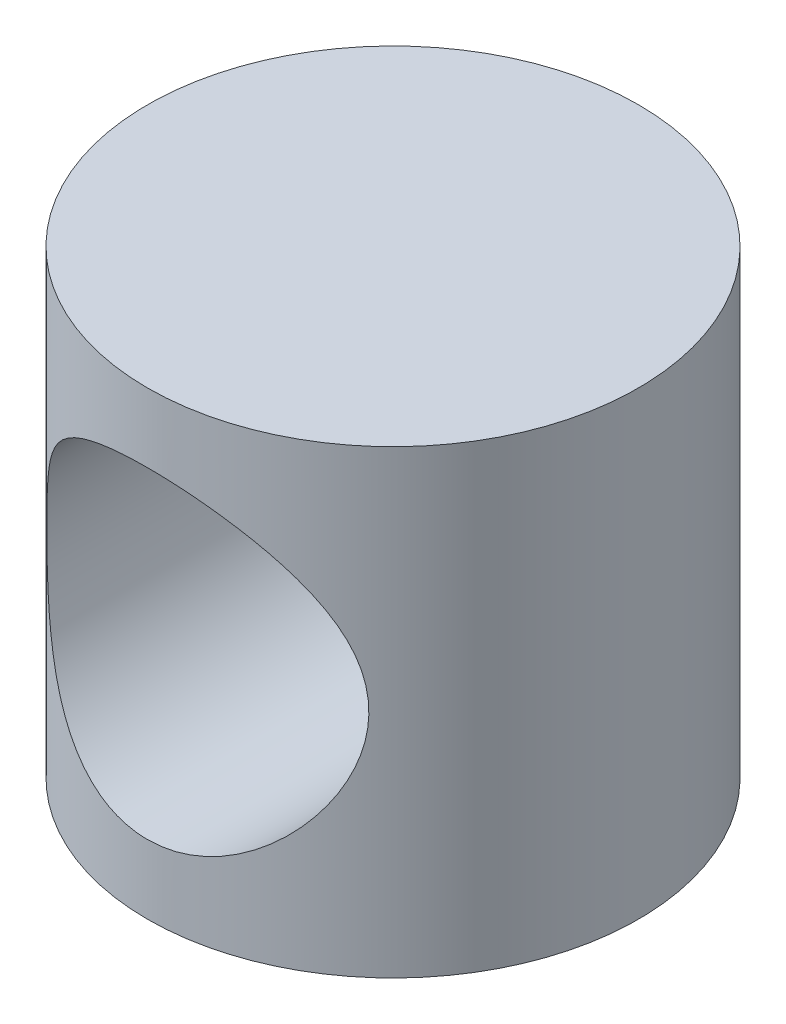
ISO-10303-21;
HEADER;
FILE_DESCRIPTION(('STEP AP214'),'2;1');
FILE_NAME('part.step','',(''),(''),'','','');
FILE_SCHEMA(('AUTOMOTIVE_DESIGN { 1 0 10303 214 1 1 1 1 }'));
ENDSEC;
DATA;
#1=APPLICATION_CONTEXT('core data for automotive mechanical design processes');
#2=APPLICATION_PROTOCOL_DEFINITION('international standard','automotive_design',2000,#1);
#3=PRODUCT_CONTEXT('',#1,'mechanical');
#4=PRODUCT('Part','Part','',(#3));
#5=PRODUCT_RELATED_PRODUCT_CATEGORY('part','',(#4));
#6=PRODUCT_DEFINITION_FORMATION('','',#4);
#7=PRODUCT_DEFINITION_CONTEXT('part definition',#1,'design');
#8=PRODUCT_DEFINITION('design','',#6,#7);
#9=PRODUCT_DEFINITION_SHAPE('','',#8);
#10=(LENGTH_UNIT() NAMED_UNIT(*) SI_UNIT(.MILLI.,.METRE.));
#11=(NAMED_UNIT(*) PLANE_ANGLE_UNIT() SI_UNIT($,.RADIAN.));
#12=(NAMED_UNIT(*) SI_UNIT($,.STERADIAN.) SOLID_ANGLE_UNIT());
#13=UNCERTAINTY_MEASURE_WITH_UNIT(LENGTH_MEASURE(1.E-05),#10,'distance_accuracy_value','');
#14=(GEOMETRIC_REPRESENTATION_CONTEXT(3) GLOBAL_UNCERTAINTY_ASSIGNED_CONTEXT((#13)) GLOBAL_UNIT_ASSIGNED_CONTEXT((#10,
#11,#12)) REPRESENTATION_CONTEXT('',''));
#15=CARTESIAN_POINT('',(0.,0.,0.));
#16=DIRECTION('',(0.,0.,1.));
#17=DIRECTION('',(1.,0.,0.));
#18=AXIS2_PLACEMENT_3D('',#15,#16,#17);
#19=CARTESIAN_POINT('',(0.,6.,0.));
#20=DIRECTION('',(0.,-1.,0.));
#21=DIRECTION('',(0.,0.,-1.));
#22=AXIS2_PLACEMENT_3D('',#19,#20,#21);
#23=CYLINDRICAL_SURFACE('',#22,3.2);
#24=CARTESIAN_POINT('',(0.,6.,0.));
#25=DIRECTION('',(0.,1.,0.));
#26=DIRECTION('',(0.,0.,1.));
#27=AXIS2_PLACEMENT_3D('',#24,#25,#26);
#28=CIRCLE('',#27,3.2);
#29=CARTESIAN_POINT('',(0.,6.,3.2));
#30=VERTEX_POINT('',#29);
#31=EDGE_CURVE('E10',#30,#30,#28,.T.);
#32=ORIENTED_EDGE('',*,*,#31,.F.);
#33=EDGE_LOOP('',(#32));
#34=FACE_BOUND('',#33,.T.);
#35=CARTESIAN_POINT('',(0.,0.,0.));
#36=DIRECTION('',(0.,1.,0.));
#37=DIRECTION('',(0.,0.,1.));
#38=AXIS2_PLACEMENT_3D('',#35,#36,#37);
#39=CIRCLE('',#38,3.2);
#40=CARTESIAN_POINT('',(0.,0.,3.2));
#41=VERTEX_POINT('',#40);
#42=EDGE_CURVE('E43',#41,#41,#39,.T.);
#43=ORIENTED_EDGE('',*,*,#42,.T.);
#44=EDGE_LOOP('',(#43));
#45=FACE_BOUND('',#44,.T.);
#46=CARTESIAN_POINT('',(-2.1,3.,2.41453929352993));
#47=CARTESIAN_POINT('',(-2.09999226365247,2.89699364525698,2.4145524635766));
#48=CARTESIAN_POINT('',(-2.09235575008475,2.79393217099932,2.42125305755193));
#49=CARTESIAN_POINT('',(-2.0624310172141,2.59145649801829,2.44678009770245));
#50=CARTESIAN_POINT('',(-2.0401163283833,2.49204923161939,2.46562844899613));
#51=CARTESIAN_POINT('',(-1.98255030736059,2.3004104019749,2.51213747112753));
#52=CARTESIAN_POINT('',(-1.94741980688409,2.20812126578504,2.53971552416261));
#53=CARTESIAN_POINT('',(-1.86556977053505,2.03088171900744,2.60043140771638));
#54=CARTESIAN_POINT('',(-1.81884766254273,1.9459329428572,2.63357047166672));
#55=CARTESIAN_POINT('',(-1.70699223958752,1.77181779140287,2.70764086926755));
#56=CARTESIAN_POINT('',(-1.640148505661,1.68393005278524,2.74899542160012));
#57=CARTESIAN_POINT('',(-1.49342314192727,1.51951336036711,2.83139244820252));
#58=CARTESIAN_POINT('',(-1.41352938444598,1.44299510000715,2.87243459465652));
#59=CARTESIAN_POINT('',(-1.22964387682933,1.29297865699375,2.95627043147515));
#60=CARTESIAN_POINT('',(-1.12384775790864,1.22135852618227,2.99852261441739));
#61=CARTESIAN_POINT('',(-0.898401100015594,1.09753978147366,3.07358654655214));
#62=CARTESIAN_POINT('',(-0.778765739131618,1.04532015013783,3.10640850314393));
#63=CARTESIAN_POINT('',(-0.542838805204878,0.968005942809017,3.15566428811688));
#64=CARTESIAN_POINT('',(-0.427616237812303,0.940566824448577,3.17349935175551));
#65=CARTESIAN_POINT('',(-0.192992879618979,0.905538084020833,3.19633930088954));
#66=CARTESIAN_POINT('',(-0.0735972959470618,0.897924560672183,3.20135963538323));
#67=CARTESIAN_POINT('',(0.146895414094658,0.902679623349095,3.19824355882461));
#68=CARTESIAN_POINT('',(0.248093936348393,0.912266462290648,3.19193856230239));
#69=CARTESIAN_POINT('',(0.44708909552965,0.945666354292174,3.17019319930021));
#70=CARTESIAN_POINT('',(0.544885480316242,0.969480459403595,3.15475215724575));
#71=CARTESIAN_POINT('',(0.734429570509817,1.03010043826454,3.1160813584206));
#72=CARTESIAN_POINT('',(0.82619002373762,1.06687781513026,3.09286869141622));
#73=CARTESIAN_POINT('',(1.00225221328169,1.15201137059967,3.04038484898631));
#74=CARTESIAN_POINT('',(1.08655250940354,1.20036977828933,3.01111250735802));
#75=CARTESIAN_POINT('',(1.25705867962597,1.31428318511271,2.94435643131442));
#76=CARTESIAN_POINT('',(1.34209090954493,1.38125571849184,2.90630001848434));
#77=CARTESIAN_POINT('',(1.50045214085423,1.5268275522944,2.82780401526181));
#78=CARTESIAN_POINT('',(1.57376286322542,1.60544465101322,2.7873608347322));
#79=CARTESIAN_POINT('',(1.71778462959783,1.7857288733492,2.70134078951793));
#80=CARTESIAN_POINT('',(1.78647739820425,1.88908501919998,2.6558978339348));
#81=CARTESIAN_POINT('',(1.90541659310689,2.10843677921079,2.57190464141039));
#82=CARTESIAN_POINT('',(1.95569510795906,2.22440994504123,2.53334247478648));
#83=CARTESIAN_POINT('',(2.02406826549067,2.43291974442965,2.47881036926106));
#84=CARTESIAN_POINT('',(2.04723298547528,2.52292188617308,2.45953777460938));
#85=CARTESIAN_POINT('',(2.08149898248722,2.70664159657746,2.43061276398626));
#86=CARTESIAN_POINT('',(2.0926200510934,2.80035280650016,2.42094456708068));
#87=CARTESIAN_POINT('',(2.10210845300381,2.98928354327483,2.41271376151865));
#88=CARTESIAN_POINT('',(2.1004277950555,3.08450740902562,2.41419294205251));
#89=CARTESIAN_POINT('',(2.08432147584653,3.27308672077319,2.42810749482591));
#90=CARTESIAN_POINT('',(2.06988524987749,3.36644055236759,2.44055194895161));
#91=CARTESIAN_POINT('',(2.03001019570742,3.5450801060671,2.47380048290435));
#92=CARTESIAN_POINT('',(2.00503388032467,3.63053915211486,2.49425079693607));
#93=CARTESIAN_POINT('',(1.94522849943452,3.79614481375673,2.54116647981166));
#94=CARTESIAN_POINT('',(1.91039617968012,3.87628966390784,2.56763383478861));
#95=CARTESIAN_POINT('',(1.82394756957865,4.0459418101227,2.62993927802003));
#96=CARTESIAN_POINT('',(1.77037194685342,4.1341482498562,2.66659451179725));
#97=CARTESIAN_POINT('',(1.6513842057871,4.30133627300705,2.74187891949999));
#98=CARTESIAN_POINT('',(1.58595771435723,4.3803064608889,2.78051044905595));
#99=CARTESIAN_POINT('',(1.42956841124822,4.54322488371141,2.86456420144688));
#100=CARTESIAN_POINT('',(1.33611813484681,4.62492293160552,2.90977085018185));
#101=CARTESIAN_POINT('',(1.13449023536266,4.77155971413879,2.99413415751208));
#102=CARTESIAN_POINT('',(1.02632715791484,4.83651482014174,3.03329671091084));
#103=CARTESIAN_POINT('',(0.819937208081056,4.93600806787015,3.09465983299485));
#104=CARTESIAN_POINT('',(0.723925051378761,4.97401368668202,3.11868082811464));
#105=CARTESIAN_POINT('',(0.525747963491915,5.03576403678395,3.15812707079957));
#106=CARTESIAN_POINT('',(0.423588231523989,5.05952063751505,3.17355947189377));
#107=CARTESIAN_POINT('',(0.215421664749419,5.09158361083943,3.19445956585062));
#108=CARTESIAN_POINT('',(0.109401230412436,5.09982859763335,3.19988766588724));
#109=CARTESIAN_POINT('',(-0.102681908419899,5.10016602746664,3.20010880683899));
#110=CARTESIAN_POINT('',(-0.208744612001908,5.09225880240883,3.19490206628355));
#111=CARTESIAN_POINT('',(-0.41073752669723,5.06180979831377,3.17504963318149));
#112=CARTESIAN_POINT('',(-0.506880783730017,5.04024152665023,3.1610322718255));
#113=CARTESIAN_POINT('',(-0.693887461023656,4.98445170697316,3.12531449121236));
#114=CARTESIAN_POINT('',(-0.784750044279718,4.9502281593505,3.10361285781738));
#115=CARTESIAN_POINT('',(-0.965239147827428,4.86783129763544,3.05248766183481));
#116=CARTESIAN_POINT('',(-1.05439638440872,4.81889218460555,3.02265197664652));
#117=CARTESIAN_POINT('',(-1.22357967831953,4.70968048377298,2.95821962180607));
#118=CARTESIAN_POINT('',(-1.30359952859324,4.64940026465602,2.92361975060989));
#119=CARTESIAN_POINT('',(-1.46543162360798,4.50855953961981,2.84635711633879));
#120=CARTESIAN_POINT('',(-1.5455699241453,4.42630189931943,2.80327929676264));
#121=CARTESIAN_POINT('',(-1.69160707550876,4.24964374295693,2.71765224370716));
#122=CARTESIAN_POINT('',(-1.75749751328959,4.15523610478406,2.6751033364372));
#123=CARTESIAN_POINT('',(-1.86764728509224,3.96572362763687,2.59920975672494));
#124=CARTESIAN_POINT('',(-1.91344509635874,3.87171630291951,2.56536798668299));
#125=CARTESIAN_POINT('',(-1.99106080395045,3.6758087826928,2.50561156482059));
#126=CARTESIAN_POINT('',(-2.02290990213381,3.57392680931662,2.47967926021777));
#127=CARTESIAN_POINT('',(-2.06435809370279,3.39308341720926,2.44518747255249));
#128=CARTESIAN_POINT('',(-2.07766479996245,3.31550591990589,2.4338132714089));
#129=CARTESIAN_POINT('',(-2.09548697303428,3.15862937839578,2.41848559531559));
#130=CARTESIAN_POINT('',(-2.10000595820002,3.07933103603008,2.41452915053001));
#131=CARTESIAN_POINT('',(-2.1,3.,2.41453929352993));
#132=B_SPLINE_CURVE_WITH_KNOTS('',3,(#46,#47,#48,#49,#50,#51,#52,#53,#54,#55,#56,#57,#58,#59,
#60,#61,#62,#63,#64,#65,#66,#67,#68,#69,#70,#71,#72,#73,#74,#75,#76,#77,#78,#79,#80,#81,#82,#83,
#84,#85,#86,#87,#88,#89,#90,#91,#92,#93,#94,#95,#96,#97,#98,#99,#100,#101,#102,#103,#104,#105,
#106,#107,#108,#109,#110,#111,#112,#113,#114,#115,#116,#117,#118,#119,#120,#121,#122,#123,#124,
#125,#126,#127,#128,#129,#130,#131),.UNSPECIFIED.,.T.,.F.,(4,2,2,2,2,2,2,2,2,2,2,2,2,2,2,2,2,2,
2,2,2,2,2,2,2,2,2,2,2,2,2,2,2,2,2,2,2,2,2,2,2,2,4),(0.,0.308658285881804,0.617874714730256,
0.924248069564824,1.23068946801436,1.58309605454869,1.93583202328717,2.33730495894214,
2.73834168369001,3.0954527378484,3.45213306738694,3.75620249189043,4.06029440393832,
4.36372196396671,4.6672079739297,5.01009700012083,5.35351563388632,5.74815071285629,
6.14209479398204,6.42569255187662,6.70882355725366,6.99301648817866,7.27744502074551,
7.5505125379072,7.82367032168554,8.15106712761687,8.47886370183985,8.87328096838951,
9.26731109535875,9.58402618412091,9.90047708128256,10.2181776910724,10.5358717726745,
10.8331419163353,11.130459050537,11.4472164509257,11.7641877614237,12.1306912489366,
12.4974105611776,12.8259209293277,13.1536926523664,13.3915031367611,13.6292183889837),.UNSPECIFIED.);
#133=CARTESIAN_POINT('',(-2.1,3.,2.41453929352993));
#134=VERTEX_POINT('',#133);
#135=EDGE_CURVE('E49',#134,#134,#132,.T.);
#136=ORIENTED_EDGE('',*,*,#135,.F.);
#137=EDGE_LOOP('',(#136));
#138=FACE_BOUND('',#137,.T.);
#139=CARTESIAN_POINT('',(0.,5.1,-3.2));
#140=CARTESIAN_POINT('',(0.105817770091933,5.09999549014605,-3.19999594750461));
#141=CARTESIAN_POINT('',(0.211666403739213,5.09195497259011,-3.19470299570056));
#142=CARTESIAN_POINT('',(0.420006124151215,5.06027212227951,-3.17404804791673));
#143=CARTESIAN_POINT('',(0.522494805482972,5.03661885758861,-3.15867899677368));
#144=CARTESIAN_POINT('',(0.720789317325533,4.97514443913992,-3.11939751762038));
#145=CARTESIAN_POINT('',(0.816624108186823,4.93738993160868,-3.09552530203644));
#146=CARTESIAN_POINT('',(1.00022938755483,4.84930300260468,-3.04117115276482));
#147=CARTESIAN_POINT('',(1.0879989060465,4.79896907089807,-3.0106884255045));
#148=CARTESIAN_POINT('',(1.26127216865649,4.68255309402072,-2.94254439687247));
#149=CARTESIAN_POINT('',(1.34597188602189,4.61550577362703,-2.90449586318647));
#150=CARTESIAN_POINT('',(1.50369078894183,4.46985039421515,-2.82607327890548));
#151=CARTESIAN_POINT('',(1.57669325611101,4.39122609111158,-2.7856960100076));
#152=CARTESIAN_POINT('',(1.7202876276692,4.21073223014697,-2.69974397457924));
#153=CARTESIAN_POINT('',(1.78882416871185,4.10714599174639,-2.65431272913137));
#154=CARTESIAN_POINT('',(1.90739977574583,3.88732856208881,-2.57042922764763));
#155=CARTESIAN_POINT('',(1.95747081403429,3.77111968253043,-2.53196496788757));
#156=CARTESIAN_POINT('',(2.02537380409854,3.56238826091073,-2.477739718662));
#157=CARTESIAN_POINT('',(2.04831302427326,3.47240365377703,-2.45863582898477));
#158=CARTESIAN_POINT('',(2.08213759985871,3.28876500827633,-2.43006313853148));
#159=CARTESIAN_POINT('',(2.09304275513362,3.1951172606593,-2.42057851309436));
#160=CARTESIAN_POINT('',(2.10212133888012,3.0063729619404,-2.41270176855068));
#161=CARTESIAN_POINT('',(2.10024801877684,2.91127236242499,-2.41435037888006));
#162=CARTESIAN_POINT('',(2.08379615560725,2.7229758508559,-2.42855931753104));
#163=CARTESIAN_POINT('',(2.06920691173211,2.62978161067735,-2.44112883607705));
#164=CARTESIAN_POINT('',(2.02903903287971,2.45131055377527,-2.4745992389697));
#165=CARTESIAN_POINT('',(2.00390156716487,2.36586727862318,-2.49516345770685));
#166=CARTESIAN_POINT('',(1.94377634707726,2.20031296533238,-2.54228024970577));
#167=CARTESIAN_POINT('',(1.90878535838395,2.12020368871876,-2.56883478866007));
#168=CARTESIAN_POINT('',(1.82194083339371,1.95055216139182,-2.63133572368083));
#169=CARTESIAN_POINT('',(1.76811508702975,1.86232249977704,-2.66809859060713));
#170=CARTESIAN_POINT('',(1.64860078007519,1.69512704775926,-2.74356037028849));
#171=CARTESIAN_POINT('',(1.58289775632004,1.61617274768715,-2.78226160141902));
#172=CARTESIAN_POINT('',(1.42595108195123,1.45342478300561,-2.86637479849322));
#173=CARTESIAN_POINT('',(1.33222928623449,1.37187830634099,-2.91156214905224));
#174=CARTESIAN_POINT('',(1.13006030709602,1.22560350220379,-2.9958171362043));
#175=CARTESIAN_POINT('',(1.02162794999696,1.16085843007264,-3.03489085024027));
#176=CARTESIAN_POINT('',(0.814929910217672,1.06188252405539,-3.09598249986005));
#177=CARTESIAN_POINT('',(0.718887723038621,1.024150307429,-3.11984492552493));
#178=CARTESIAN_POINT('',(0.520702963219536,0.962943642557332,-3.15896188584983));
#179=CARTESIAN_POINT('',(0.418565541092471,0.939457338672986,-3.17422357740356));
#180=CARTESIAN_POINT('',(0.210506190069124,0.907920732643659,-3.19478489075908));
#181=CARTESIAN_POINT('',(0.10457105089211,0.899931010165075,-3.20004541413777));
#182=CARTESIAN_POINT('',(-0.107289432585818,0.900069869537592,-3.1999540085593));
#183=CARTESIAN_POINT('',(-0.213214777000616,0.908198231552754,-3.19460222434431));
#184=CARTESIAN_POINT('',(-0.415003564171961,0.93904552789889,-3.17449371836886));
#185=CARTESIAN_POINT('',(-0.511079299599049,0.960807403833062,-3.16035435780659));
#186=CARTESIAN_POINT('',(-0.697922276380462,1.01696495570216,-3.1244141496378));
#187=CARTESIAN_POINT('',(-0.788688659354097,1.05136266800641,-3.1026120671449));
#188=CARTESIAN_POINT('',(-0.969045872757724,1.13413727572923,-3.0512815048758));
#189=CARTESIAN_POINT('',(-1.05815884866897,1.18329045500601,-3.02133625839192));
#190=CARTESIAN_POINT('',(-1.22722407717936,1.29292962832301,-2.95670898247105));
#191=CARTESIAN_POINT('',(-1.30717000946162,1.35342336641256,-2.92202372066517));
#192=CARTESIAN_POINT('',(-1.46883377601302,1.4947441836943,-2.84460180239343));
#193=CARTESIAN_POINT('',(-1.54886983515858,1.57727186437165,-2.80145474611528));
#194=CARTESIAN_POINT('',(-1.6946501773836,1.75447441173073,-2.71575269326495));
#195=CARTESIAN_POINT('',(-1.76038708906248,1.84915550385632,-2.67319801260037));
#196=CARTESIAN_POINT('',(-1.87001287206093,2.03889022635981,-2.59749950249845));
#197=CARTESIAN_POINT('',(-1.91548895237332,2.13281442737878,-2.56383584169387));
#198=CARTESIAN_POINT('',(-1.99251757637104,2.32852215339727,-2.50444640487469));
#199=CARTESIAN_POINT('',(-2.02409526545454,2.43029109001891,-2.47870631886837));
#200=CARTESIAN_POINT('',(-2.0678031492547,2.6227829185929,-2.44230871353287));
#201=CARTESIAN_POINT('',(-2.08224946182125,2.71263782506507,-2.42988747681712));
#202=CARTESIAN_POINT('',(-2.09931353411731,2.89425793810515,-2.4151647304671));
#203=CARTESIAN_POINT('',(-2.10194180016878,2.98602137502396,-2.41285423236796));
#204=CARTESIAN_POINT('',(-2.09520641058978,3.16872646936279,-2.4187031666036));
#205=CARTESIAN_POINT('',(-2.08584592104869,3.2596683373632,-2.42685983468397));
#206=CARTESIAN_POINT('',(-2.0557447993905,3.43834768085021,-2.45240509681178));
#207=CARTESIAN_POINT('',(-2.03498927314193,3.52608080184782,-2.46980577247568));
#208=CARTESIAN_POINT('',(-1.97572775560579,3.72083155123064,-2.51760161229534));
#209=CARTESIAN_POINT('',(-1.93385567606612,3.82625482488948,-2.55028322751603));
#210=CARTESIAN_POINT('',(-1.83501934572211,4.02727725853153,-2.62229650147264));
#211=CARTESIAN_POINT('',(-1.77803425013179,4.12286259472765,-2.66163731766063));
#212=CARTESIAN_POINT('',(-1.64929840023168,4.30476872042988,-2.7433041581385));
#213=CARTESIAN_POINT('',(-1.57731855305518,4.39090968249358,-2.78566885512102));
#214=CARTESIAN_POINT('',(-1.42018452925029,4.55102425296888,-2.86897306841547));
#215=CARTESIAN_POINT('',(-1.33502677999392,4.62499455056835,-2.9099121945464));
#216=CARTESIAN_POINT('',(-1.14168915285584,4.76706088326538,-2.99144343697406));
#217=CARTESIAN_POINT('',(-1.03198360960989,4.83347317681293,-3.03144143808595));
#218=CARTESIAN_POINT('',(-0.857907605716246,4.91785339993997,-3.08345316254243));
#219=CARTESIAN_POINT('',(-0.798311887921719,4.94343599818127,-3.09945655613016));
#220=CARTESIAN_POINT('',(-0.676353702705965,4.98916637157934,-3.12833289120905));
#221=CARTESIAN_POINT('',(-0.613992457559335,5.00931652037067,-3.14120719966825));
#222=CARTESIAN_POINT('',(-0.461734959394883,5.05066964039821,-3.16779086473509));
#223=CARTESIAN_POINT('',(-0.370758610465216,5.06909938670029,-3.17979298730271));
#224=CARTESIAN_POINT('',(-0.186528827577598,5.09376389560049,-3.19589761887955));
#225=CARTESIAN_POINT('',(-0.0932764044281479,5.10000397535273,-3.20000357219963));
#226=CARTESIAN_POINT('',(0.,5.1,-3.2));
#227=B_SPLINE_CURVE_WITH_KNOTS('',3,(#139,#140,#141,#142,#143,#144,#145,#146,#147,#148,#149,
#150,#151,#152,#153,#154,#155,#156,#157,#158,#159,#160,#161,#162,#163,#164,#165,#166,#167,#168,
#169,#170,#171,#172,#173,#174,#175,#176,#177,#178,#179,#180,#181,#182,#183,#184,#185,#186,#187,
#188,#189,#190,#191,#192,#193,#194,#195,#196,#197,#198,#199,#200,#201,#202,#203,#204,#205,#206,
#207,#208,#209,#210,#211,#212,#213,#214,#215,#216,#217,#218,#219,#220,#221,#222,#223,#224,#225,
#226),.UNSPECIFIED.,.T.,.F.,(4,2,2,2,2,2,2,2,2,2,2,2,2,2,2,2,2,2,2,2,2,2,2,2,2,2,2,2,2,2,2,2,2,
2,2,2,2,2,2,2,2,2,2,4),(0.,0.317086427578821,0.634395112708117,0.950222708722755,
1.26608823992763,1.60838231600821,1.95116133677012,2.34607492650173,2.74030149221027,
3.02358175401941,3.30639523154634,3.59024390294944,3.87433167190078,4.14756528572672,
4.42088869050815,4.74881402187029,5.07714139691476,5.47182836333585,5.866120451885,
6.18251723514623,6.49865034621104,6.81601682235545,7.13337896994102,7.43063369163349,
7.72793633940922,8.04497117246521,8.36222329075347,8.7291393085257,9.09624403044665,
9.42396968119107,9.75109993849232,10.0254352677219,10.2995266627384,10.5735456883633,
10.8479237321979,11.200179780296,11.5529242310438,11.9115156299264,12.2702044164948,
12.6706097269861,12.8707135309458,13.0707297600573,13.3503575744479,13.6298633874302),.UNSPECIFIED.);
#228=CARTESIAN_POINT('',(0.,5.1,-3.2));
#229=VERTEX_POINT('',#228);
#230=EDGE_CURVE('E35',#229,#229,#227,.T.);
#231=ORIENTED_EDGE('',*,*,#230,.F.);
#232=EDGE_LOOP('',(#231));
#233=FACE_BOUND('',#232,.T.);
#234=ADVANCED_FACE('F31',(#34,#45,#138,#233),#23,.T.);
#235=CARTESIAN_POINT('',(0.,6.,0.));
#236=DIRECTION('',(0.,1.,0.));
#237=DIRECTION('',(0.,0.,1.));
#238=AXIS2_PLACEMENT_3D('',#235,#236,#237);
#239=PLANE('',#238);
#240=ORIENTED_EDGE('',*,*,#31,.T.);
#241=EDGE_LOOP('',(#240));
#242=FACE_BOUND('',#241,.T.);
#243=ADVANCED_FACE('F60',(#242),#239,.T.);
#244=CARTESIAN_POINT('',(0.,0.,0.));
#245=DIRECTION('',(0.,1.,0.));
#246=DIRECTION('',(0.,0.,1.));
#247=AXIS2_PLACEMENT_3D('',#244,#245,#246);
#248=PLANE('',#247);
#249=ORIENTED_EDGE('',*,*,#42,.F.);
#250=EDGE_LOOP('',(#249));
#251=FACE_BOUND('',#250,.T.);
#252=ADVANCED_FACE('F58',(#251),#248,.F.);
#253=CARTESIAN_POINT('',(0.,3.,10.));
#254=DIRECTION('',(0.,0.,-1.));
#255=DIRECTION('',(-1.,0.,0.));
#256=AXIS2_PLACEMENT_3D('',#253,#254,#255);
#257=CYLINDRICAL_SURFACE('',#256,2.1);
#258=ORIENTED_EDGE('',*,*,#135,.T.);
#259=EDGE_LOOP('',(#258));
#260=FACE_BOUND('',#259,.T.);
#261=ORIENTED_EDGE('',*,*,#230,.T.);
#262=EDGE_LOOP('',(#261));
#263=FACE_BOUND('',#262,.T.);
#264=ADVANCED_FACE('F54',(#260,#263),#257,.F.);
#265=CLOSED_SHELL('',(#234,#243,#252,#264));
#266=MANIFOLD_SOLID_BREP('B2',#265);
#267=ADVANCED_BREP_SHAPE_REPRESENTATION('',(#18,#266),#14);
#268=SHAPE_DEFINITION_REPRESENTATION(#9,#267);
ENDSEC;
END-ISO-10303-21;
